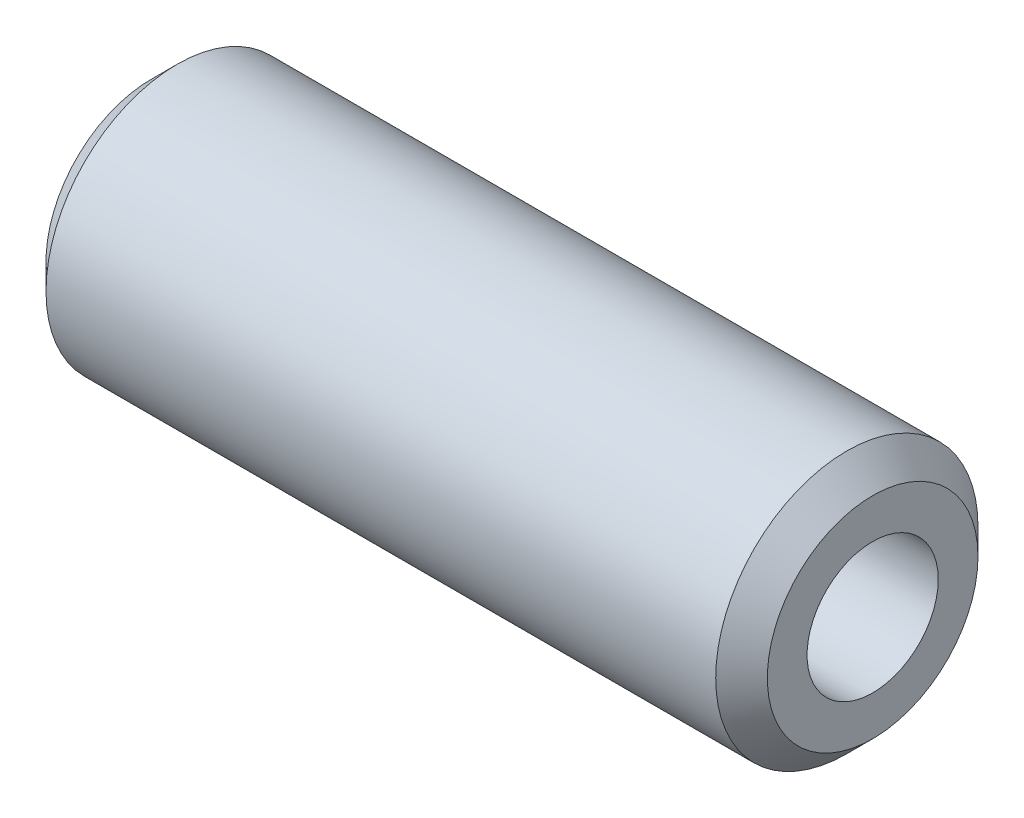
ISO-10303-21;
HEADER;
FILE_DESCRIPTION(('STEP AP214'),'2;1');
FILE_NAME('part.step','',(''),(''),'','','');
FILE_SCHEMA(('AUTOMOTIVE_DESIGN { 1 0 10303 214 1 1 1 1 }'));
ENDSEC;
DATA;
#1=APPLICATION_CONTEXT('core data for automotive mechanical design processes');
#2=APPLICATION_PROTOCOL_DEFINITION('international standard','automotive_design',2000,#1);
#3=PRODUCT_CONTEXT('',#1,'mechanical');
#4=PRODUCT('Part','Part','',(#3));
#5=PRODUCT_RELATED_PRODUCT_CATEGORY('part','',(#4));
#6=PRODUCT_DEFINITION_FORMATION('','',#4);
#7=PRODUCT_DEFINITION_CONTEXT('part definition',#1,'design');
#8=PRODUCT_DEFINITION('design','',#6,#7);
#9=PRODUCT_DEFINITION_SHAPE('','',#8);
#10=(LENGTH_UNIT() NAMED_UNIT(*) SI_UNIT(.MILLI.,.METRE.));
#11=(NAMED_UNIT(*) PLANE_ANGLE_UNIT() SI_UNIT($,.RADIAN.));
#12=(NAMED_UNIT(*) SI_UNIT($,.STERADIAN.) SOLID_ANGLE_UNIT());
#13=UNCERTAINTY_MEASURE_WITH_UNIT(LENGTH_MEASURE(1.E-05),#10,'distance_accuracy_value','');
#14=(GEOMETRIC_REPRESENTATION_CONTEXT(3) GLOBAL_UNCERTAINTY_ASSIGNED_CONTEXT((#13)) GLOBAL_UNIT_ASSIGNED_CONTEXT((#10,
#11,#12)) REPRESENTATION_CONTEXT('',''));
#15=CARTESIAN_POINT('',(0.,0.,0.));
#16=DIRECTION('',(0.,0.,1.));
#17=DIRECTION('',(1.,0.,0.));
#18=AXIS2_PLACEMENT_3D('',#15,#16,#17);
#19=CARTESIAN_POINT('',(69.85,0.,0.));
#20=DIRECTION('',(1.,0.,0.));
#21=DIRECTION('',(0.,0.,-1.));
#22=AXIS2_PLACEMENT_3D('',#19,#20,#21);
#23=PLANE('',#22);
#24=CARTESIAN_POINT('',(69.85,0.,0.));
#25=DIRECTION('',(1.,0.,0.));
#26=DIRECTION('',(0.,0.,-1.));
#27=AXIS2_PLACEMENT_3D('',#24,#25,#26);
#28=CIRCLE('',#27,10.2);
#29=CARTESIAN_POINT('',(69.85,0.,-10.2));
#30=VERTEX_POINT('',#29);
#31=EDGE_CURVE('E58',#30,#30,#28,.T.);
#32=ORIENTED_EDGE('',*,*,#31,.T.);
#33=EDGE_LOOP('',(#32));
#34=FACE_BOUND('',#33,.T.);
#35=CARTESIAN_POINT('',(69.85,0.,0.));
#36=DIRECTION('',(1.,0.,0.));
#37=DIRECTION('',(0.,0.,-1.));
#38=AXIS2_PLACEMENT_3D('',#35,#36,#37);
#39=CIRCLE('',#38,6.35);
#40=CARTESIAN_POINT('',(69.85,0.,-6.35));
#41=VERTEX_POINT('',#40);
#42=EDGE_CURVE('E64',#41,#41,#39,.T.);
#43=ORIENTED_EDGE('',*,*,#42,.F.);
#44=EDGE_LOOP('',(#43));
#45=FACE_BOUND('',#44,.T.);
#46=ADVANCED_FACE('F39',(#34,#45),#23,.T.);
#47=CARTESIAN_POINT('',(0.,0.,0.));
#48=DIRECTION('',(1.,0.,0.));
#49=DIRECTION('',(0.,0.,-1.));
#50=AXIS2_PLACEMENT_3D('',#47,#48,#49);
#51=PLANE('',#50);
#52=CARTESIAN_POINT('',(0.,0.,0.));
#53=DIRECTION('',(1.,0.,0.));
#54=DIRECTION('',(0.,0.,-1.));
#55=AXIS2_PLACEMENT_3D('',#52,#53,#54);
#56=CIRCLE('',#55,10.2);
#57=CARTESIAN_POINT('',(0.,0.,-10.2));
#58=VERTEX_POINT('',#57);
#59=EDGE_CURVE('E10',#58,#58,#56,.F.);
#60=ORIENTED_EDGE('',*,*,#59,.T.);
#61=EDGE_LOOP('',(#60));
#62=FACE_BOUND('',#61,.T.);
#63=CARTESIAN_POINT('',(0.,0.,0.));
#64=DIRECTION('',(1.,0.,0.));
#65=DIRECTION('',(0.,0.,-1.));
#66=AXIS2_PLACEMENT_3D('',#63,#64,#65);
#67=CIRCLE('',#66,6.35);
#68=CARTESIAN_POINT('',(0.,0.,-6.35));
#69=VERTEX_POINT('',#68);
#70=EDGE_CURVE('E65',#69,#69,#67,.T.);
#71=ORIENTED_EDGE('',*,*,#70,.T.);
#72=EDGE_LOOP('',(#71));
#73=FACE_BOUND('',#72,.T.);
#74=ADVANCED_FACE('F77',(#62,#73),#51,.F.);
#75=CARTESIAN_POINT('',(69.85,0.,0.));
#76=DIRECTION('',(-1.,0.,0.));
#77=DIRECTION('',(0.,0.,1.));
#78=AXIS2_PLACEMENT_3D('',#75,#76,#77);
#79=CYLINDRICAL_SURFACE('',#78,12.7);
#80=CARTESIAN_POINT('',(67.35,0.,0.));
#81=DIRECTION('',(1.,0.,0.));
#82=DIRECTION('',(0.,0.,-1.));
#83=AXIS2_PLACEMENT_3D('',#80,#81,#82);
#84=CIRCLE('',#83,12.7);
#85=CARTESIAN_POINT('',(67.35,0.,-12.7));
#86=VERTEX_POINT('',#85);
#87=EDGE_CURVE('E48',#86,#86,#84,.F.);
#88=ORIENTED_EDGE('',*,*,#87,.T.);
#89=EDGE_LOOP('',(#88));
#90=FACE_BOUND('',#89,.T.);
#91=CARTESIAN_POINT('',(2.5,0.,0.));
#92=DIRECTION('',(1.,0.,0.));
#93=DIRECTION('',(0.,0.,-1.));
#94=AXIS2_PLACEMENT_3D('',#91,#92,#93);
#95=CIRCLE('',#94,12.7);
#96=CARTESIAN_POINT('',(2.5,0.,-12.7));
#97=VERTEX_POINT('',#96);
#98=EDGE_CURVE('E53',#97,#97,#95,.T.);
#99=ORIENTED_EDGE('',*,*,#98,.T.);
#100=EDGE_LOOP('',(#99));
#101=FACE_BOUND('',#100,.T.);
#102=ADVANCED_FACE('F83',(#90,#101),#79,.T.);
#103=CARTESIAN_POINT('',(69.85,0.,0.));
#104=DIRECTION('',(-1.,0.,0.));
#105=DIRECTION('',(0.,0.,1.));
#106=AXIS2_PLACEMENT_3D('',#103,#104,#105);
#107=CYLINDRICAL_SURFACE('',#106,6.35);
#108=ORIENTED_EDGE('',*,*,#42,.T.);
#109=EDGE_LOOP('',(#108));
#110=FACE_BOUND('',#109,.T.);
#111=ORIENTED_EDGE('',*,*,#70,.F.);
#112=EDGE_LOOP('',(#111));
#113=FACE_BOUND('',#112,.T.);
#114=ADVANCED_FACE('F73',(#110,#113),#107,.F.);
#115=CARTESIAN_POINT('',(69.85,0.,0.));
#116=DIRECTION('',(-1.,0.,0.));
#117=DIRECTION('',(0.,0.,1.));
#118=AXIS2_PLACEMENT_3D('',#115,#116,#117);
#119=CONICAL_SURFACE('',#118,10.2,0.785398163397448);
#120=ORIENTED_EDGE('',*,*,#87,.F.);
#121=EDGE_LOOP('',(#120));
#122=FACE_BOUND('',#121,.T.);
#123=ORIENTED_EDGE('',*,*,#31,.F.);
#124=EDGE_LOOP('',(#123));
#125=FACE_BOUND('',#124,.T.);
#126=ADVANCED_FACE('F89',(#122,#125),#119,.T.);
#127=CARTESIAN_POINT('',(2.5,0.,0.));
#128=DIRECTION('',(1.,0.,0.));
#129=DIRECTION('',(0.,0.,-1.));
#130=AXIS2_PLACEMENT_3D('',#127,#128,#129);
#131=CONICAL_SURFACE('',#130,12.7,0.785398163397453);
#132=ORIENTED_EDGE('',*,*,#59,.F.);
#133=EDGE_LOOP('',(#132));
#134=FACE_BOUND('',#133,.T.);
#135=ORIENTED_EDGE('',*,*,#98,.F.);
#136=EDGE_LOOP('',(#135));
#137=FACE_BOUND('',#136,.T.);
#138=ADVANCED_FACE('F42',(#134,#137),#131,.T.);
#139=CLOSED_SHELL('',(#46,#74,#102,#114,#126,#138));
#140=MANIFOLD_SOLID_BREP('B2',#139);
#141=ADVANCED_BREP_SHAPE_REPRESENTATION('',(#18,#140),#14);
#142=SHAPE_DEFINITION_REPRESENTATION(#9,#141);
ENDSEC;
END-ISO-10303-21;
